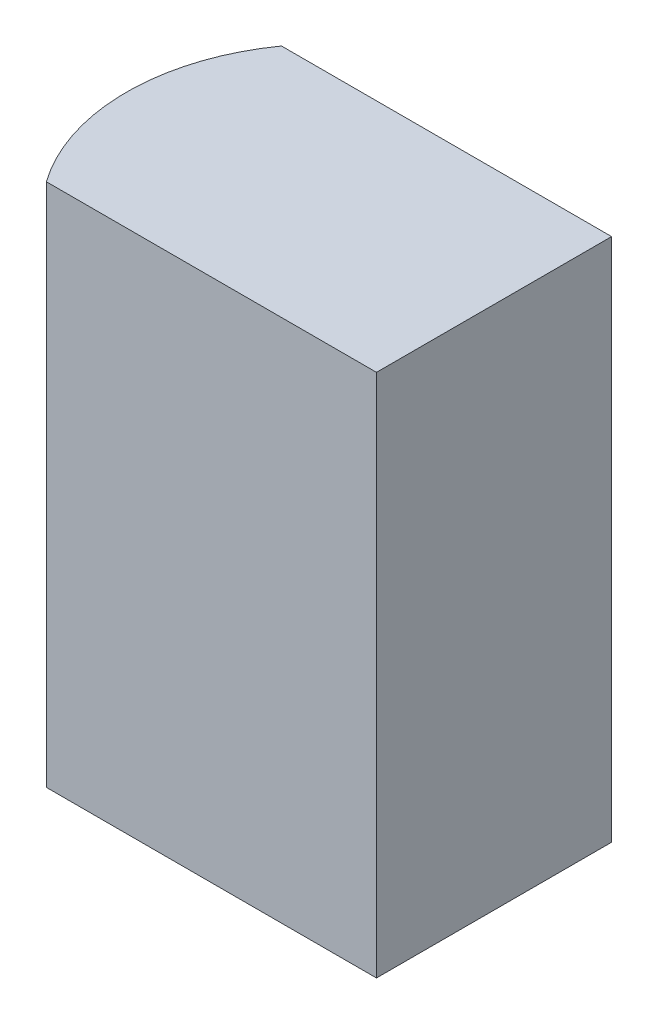
ISO-10303-21;
HEADER;
FILE_DESCRIPTION(('STEP AP214'),'2;1');
FILE_NAME('part.step','',(''),(''),'','','');
FILE_SCHEMA(('AUTOMOTIVE_DESIGN { 1 0 10303 214 1 1 1 1 }'));
ENDSEC;
DATA;
#1=APPLICATION_CONTEXT('core data for automotive mechanical design processes');
#2=APPLICATION_PROTOCOL_DEFINITION('international standard','automotive_design',2000,#1);
#3=PRODUCT_CONTEXT('',#1,'mechanical');
#4=PRODUCT('Part','Part','',(#3));
#5=PRODUCT_RELATED_PRODUCT_CATEGORY('part','',(#4));
#6=PRODUCT_DEFINITION_FORMATION('','',#4);
#7=PRODUCT_DEFINITION_CONTEXT('part definition',#1,'design');
#8=PRODUCT_DEFINITION('design','',#6,#7);
#9=PRODUCT_DEFINITION_SHAPE('','',#8);
#10=(LENGTH_UNIT() NAMED_UNIT(*) SI_UNIT(.MILLI.,.METRE.));
#11=(NAMED_UNIT(*) PLANE_ANGLE_UNIT() SI_UNIT($,.RADIAN.));
#12=(NAMED_UNIT(*) SI_UNIT($,.STERADIAN.) SOLID_ANGLE_UNIT());
#13=UNCERTAINTY_MEASURE_WITH_UNIT(LENGTH_MEASURE(1.E-05),#10,'distance_accuracy_value','');
#14=(GEOMETRIC_REPRESENTATION_CONTEXT(3) GLOBAL_UNCERTAINTY_ASSIGNED_CONTEXT((#13)) GLOBAL_UNIT_ASSIGNED_CONTEXT((#10,
#11,#12)) REPRESENTATION_CONTEXT('',''));
#15=CARTESIAN_POINT('',(0.,0.,0.));
#16=DIRECTION('',(0.,0.,1.));
#17=DIRECTION('',(1.,0.,0.));
#18=AXIS2_PLACEMENT_3D('',#15,#16,#17);
#19=CARTESIAN_POINT('',(182.5,580.,130.));
#20=DIRECTION('',(-1.,0.,0.));
#21=DIRECTION('',(0.,0.,1.));
#22=AXIS2_PLACEMENT_3D('',#19,#20,#21);
#23=PLANE('',#22);
#24=DIRECTION('',(0.,0.,-1.));
#25=VECTOR('',#24,1.);
#26=CARTESIAN_POINT('',(182.5,0.,130.));
#27=LINE('',#26,#25);
#28=CARTESIAN_POINT('',(182.5,0.,130.));
#29=VERTEX_POINT('',#28);
#30=CARTESIAN_POINT('',(182.5,0.,-130.));
#31=VERTEX_POINT('',#30);
#32=EDGE_CURVE('E100',#29,#31,#27,.T.);
#33=ORIENTED_EDGE('',*,*,#32,.T.);
#34=DIRECTION('',(0.,-1.,0.));
#35=VECTOR('',#34,1.);
#36=CARTESIAN_POINT('',(182.5,580.,-130.));
#37=LINE('',#36,#35);
#38=CARTESIAN_POINT('',(182.5,580.,-130.));
#39=VERTEX_POINT('',#38);
#40=EDGE_CURVE('E11',#39,#31,#37,.T.);
#41=ORIENTED_EDGE('',*,*,#40,.F.);
#42=DIRECTION('',(0.,0.,-1.));
#43=VECTOR('',#42,1.);
#44=CARTESIAN_POINT('',(182.5,580.,130.));
#45=LINE('',#44,#43);
#46=CARTESIAN_POINT('',(182.5,580.,130.));
#47=VERTEX_POINT('',#46);
#48=EDGE_CURVE('E88',#47,#39,#45,.T.);
#49=ORIENTED_EDGE('',*,*,#48,.F.);
#50=DIRECTION('',(0.,-1.,0.));
#51=VECTOR('',#50,1.);
#52=CARTESIAN_POINT('',(182.5,580.,130.));
#53=LINE('',#52,#51);
#54=EDGE_CURVE('E96',#47,#29,#53,.T.);
#55=ORIENTED_EDGE('',*,*,#54,.T.);
#56=EDGE_LOOP('',(#33,#41,#49,#55));
#57=FACE_BOUND('',#56,.T.);
#58=ADVANCED_FACE('F37',(#57),#23,.F.);
#59=CARTESIAN_POINT('',(-182.5,580.,-130.));
#60=DIRECTION('',(0.,0.,1.));
#61=DIRECTION('',(1.,0.,0.));
#62=AXIS2_PLACEMENT_3D('',#59,#60,#61);
#63=PLANE('',#62);
#64=DIRECTION('',(-1.,0.,0.));
#65=VECTOR('',#64,1.);
#66=CARTESIAN_POINT('',(-182.5,0.,-130.));
#67=LINE('',#66,#65);
#68=CARTESIAN_POINT('',(-182.5,0.,-130.));
#69=VERTEX_POINT('',#68);
#70=EDGE_CURVE('E92',#31,#69,#67,.T.);
#71=ORIENTED_EDGE('',*,*,#70,.T.);
#72=DIRECTION('',(0.,-1.,0.));
#73=VECTOR('',#72,1.);
#74=CARTESIAN_POINT('',(-182.5,580.,-130.));
#75=LINE('',#74,#73);
#76=CARTESIAN_POINT('',(-182.5,580.,-130.));
#77=VERTEX_POINT('',#76);
#78=EDGE_CURVE('E45',#77,#69,#75,.T.);
#79=ORIENTED_EDGE('',*,*,#78,.F.);
#80=DIRECTION('',(-1.,0.,0.));
#81=VECTOR('',#80,1.);
#82=CARTESIAN_POINT('',(-182.5,580.,-130.));
#83=LINE('',#82,#81);
#84=EDGE_CURVE('E83',#39,#77,#83,.T.);
#85=ORIENTED_EDGE('',*,*,#84,.F.);
#86=ORIENTED_EDGE('',*,*,#40,.T.);
#87=EDGE_LOOP('',(#71,#79,#85,#86));
#88=FACE_BOUND('',#87,.T.);
#89=ADVANCED_FACE('F91',(#88),#63,.F.);
#90=CARTESIAN_POINT('',(0.,580.,0.));
#91=DIRECTION('',(0.,-1.,0.));
#92=DIRECTION('',(0.,0.,-1.));
#93=AXIS2_PLACEMENT_3D('',#90,#91,#92);
#94=CYLINDRICAL_SURFACE('',#93,224.067512147567);
#95=CARTESIAN_POINT('',(0.,0.,0.));
#96=DIRECTION('',(0.,1.,0.));
#97=DIRECTION('',(0.,0.,1.));
#98=AXIS2_PLACEMENT_3D('',#95,#96,#97);
#99=CIRCLE('',#98,224.067512147567);
#100=CARTESIAN_POINT('',(-182.5,0.,130.));
#101=VERTEX_POINT('',#100);
#102=EDGE_CURVE('E70',#69,#101,#99,.T.);
#103=ORIENTED_EDGE('',*,*,#102,.T.);
#104=DIRECTION('',(0.,-1.,0.));
#105=VECTOR('',#104,1.);
#106=CARTESIAN_POINT('',(-182.5,580.,130.));
#107=LINE('',#106,#105);
#108=CARTESIAN_POINT('',(-182.5,580.,130.));
#109=VERTEX_POINT('',#108);
#110=EDGE_CURVE('E93',#109,#101,#107,.T.);
#111=ORIENTED_EDGE('',*,*,#110,.F.);
#112=CARTESIAN_POINT('',(0.,580.,0.));
#113=DIRECTION('',(0.,1.,0.));
#114=DIRECTION('',(0.,0.,1.));
#115=AXIS2_PLACEMENT_3D('',#112,#113,#114);
#116=CIRCLE('',#115,224.067512147567);
#117=EDGE_CURVE('E86',#77,#109,#116,.T.);
#118=ORIENTED_EDGE('',*,*,#117,.F.);
#119=ORIENTED_EDGE('',*,*,#78,.T.);
#120=EDGE_LOOP('',(#103,#111,#118,#119));
#121=FACE_BOUND('',#120,.T.);
#122=ADVANCED_FACE('F94',(#121),#94,.T.);
#123=CARTESIAN_POINT('',(-182.5,580.,130.));
#124=DIRECTION('',(0.,0.,-1.));
#125=DIRECTION('',(-1.,0.,0.));
#126=AXIS2_PLACEMENT_3D('',#123,#124,#125);
#127=PLANE('',#126);
#128=DIRECTION('',(1.,0.,0.));
#129=VECTOR('',#128,1.);
#130=CARTESIAN_POINT('',(-182.5,0.,130.));
#131=LINE('',#130,#129);
#132=EDGE_CURVE('E76',#101,#29,#131,.T.);
#133=ORIENTED_EDGE('',*,*,#132,.T.);
#134=ORIENTED_EDGE('',*,*,#54,.F.);
#135=DIRECTION('',(1.,0.,0.));
#136=VECTOR('',#135,1.);
#137=CARTESIAN_POINT('',(-182.5,580.,130.));
#138=LINE('',#137,#136);
#139=EDGE_CURVE('E53',#109,#47,#138,.T.);
#140=ORIENTED_EDGE('',*,*,#139,.F.);
#141=ORIENTED_EDGE('',*,*,#110,.T.);
#142=EDGE_LOOP('',(#133,#134,#140,#141));
#143=FACE_BOUND('',#142,.T.);
#144=ADVANCED_FACE('F107',(#143),#127,.F.);
#145=CARTESIAN_POINT('',(0.,580.,0.));
#146=DIRECTION('',(0.,1.,0.));
#147=DIRECTION('',(0.,0.,1.));
#148=AXIS2_PLACEMENT_3D('',#145,#146,#147);
#149=PLANE('',#148);
#150=ORIENTED_EDGE('',*,*,#48,.T.);
#151=ORIENTED_EDGE('',*,*,#84,.T.);
#152=ORIENTED_EDGE('',*,*,#117,.T.);
#153=ORIENTED_EDGE('',*,*,#139,.T.);
#154=EDGE_LOOP('',(#150,#151,#152,#153));
#155=FACE_BOUND('',#154,.T.);
#156=ADVANCED_FACE('F84',(#155),#149,.T.);
#157=CARTESIAN_POINT('',(0.,0.,0.));
#158=DIRECTION('',(0.,1.,0.));
#159=DIRECTION('',(0.,0.,1.));
#160=AXIS2_PLACEMENT_3D('',#157,#158,#159);
#161=PLANE('',#160);
#162=ORIENTED_EDGE('',*,*,#32,.F.);
#163=ORIENTED_EDGE('',*,*,#132,.F.);
#164=ORIENTED_EDGE('',*,*,#102,.F.);
#165=ORIENTED_EDGE('',*,*,#70,.F.);
#166=EDGE_LOOP('',(#162,#163,#164,#165));
#167=FACE_BOUND('',#166,.T.);
#168=ADVANCED_FACE('F110',(#167),#161,.F.);
#169=CLOSED_SHELL('',(#58,#89,#122,#144,#156,#168));
#170=MANIFOLD_SOLID_BREP('B2',#169);
#171=ADVANCED_BREP_SHAPE_REPRESENTATION('',(#18,#170),#14);
#172=SHAPE_DEFINITION_REPRESENTATION(#9,#171);
ENDSEC;
END-ISO-10303-21;
